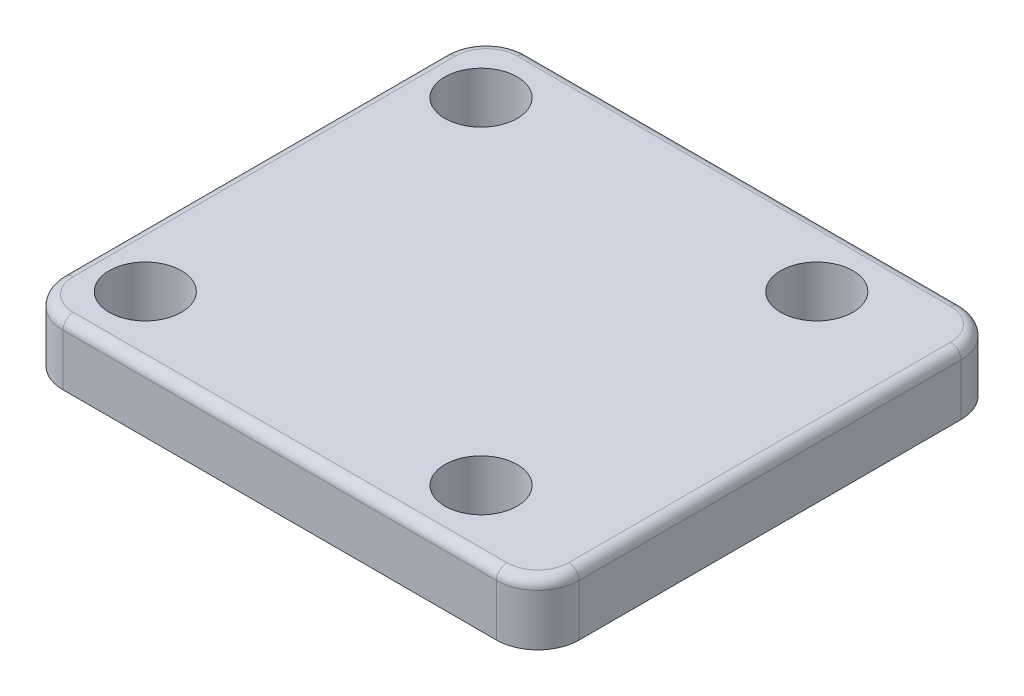
ISO-10303-21;
HEADER;
FILE_DESCRIPTION(('STEP AP214'),'2;1');
FILE_NAME('part.step','',(''),(''),'','','');
FILE_SCHEMA(('AUTOMOTIVE_DESIGN { 1 0 10303 214 1 1 1 1 }'));
ENDSEC;
DATA;
#1=APPLICATION_CONTEXT('core data for automotive mechanical design processes');
#2=APPLICATION_PROTOCOL_DEFINITION('international standard','automotive_design',2000,#1);
#3=PRODUCT_CONTEXT('',#1,'mechanical');
#4=PRODUCT('Part','Part','',(#3));
#5=PRODUCT_RELATED_PRODUCT_CATEGORY('part','',(#4));
#6=PRODUCT_DEFINITION_FORMATION('','',#4);
#7=PRODUCT_DEFINITION_CONTEXT('part definition',#1,'design');
#8=PRODUCT_DEFINITION('design','',#6,#7);
#9=PRODUCT_DEFINITION_SHAPE('','',#8);
#10=(LENGTH_UNIT() NAMED_UNIT(*) SI_UNIT(.MILLI.,.METRE.));
#11=(NAMED_UNIT(*) PLANE_ANGLE_UNIT() SI_UNIT($,.RADIAN.));
#12=(NAMED_UNIT(*) SI_UNIT($,.STERADIAN.) SOLID_ANGLE_UNIT());
#13=UNCERTAINTY_MEASURE_WITH_UNIT(LENGTH_MEASURE(1.E-05),#10,'distance_accuracy_value','');
#14=(GEOMETRIC_REPRESENTATION_CONTEXT(3) GLOBAL_UNCERTAINTY_ASSIGNED_CONTEXT((#13)) GLOBAL_UNIT_ASSIGNED_CONTEXT((#10,
#11,#12)) REPRESENTATION_CONTEXT('',''));
#15=CARTESIAN_POINT('',(0.,0.,0.));
#16=DIRECTION('',(0.,0.,1.));
#17=DIRECTION('',(1.,0.,0.));
#18=AXIS2_PLACEMENT_3D('',#15,#16,#17);
#19=CARTESIAN_POINT('',(-18.,6.,-18.5));
#20=DIRECTION('',(0.,-1.,0.));
#21=DIRECTION('',(0.,0.,-1.));
#22=AXIS2_PLACEMENT_3D('',#19,#20,#21);
#23=CYLINDRICAL_SURFACE('',#22,4.);
#24=DIRECTION('',(0.,-1.,0.));
#25=VECTOR('',#24,1.);
#26=CARTESIAN_POINT('',(-22.,6.,-18.5));
#27=LINE('',#26,#25);
#28=CARTESIAN_POINT('',(-22.,5.,-18.5));
#29=VERTEX_POINT('',#28);
#30=CARTESIAN_POINT('',(-22.,0.,-18.5));
#31=VERTEX_POINT('',#30);
#32=EDGE_CURVE('E139',#29,#31,#27,.T.);
#33=ORIENTED_EDGE('',*,*,#32,.F.);
#34=CARTESIAN_POINT('',(-18.,5.,-18.5));
#35=DIRECTION('',(0.,1.,0.));
#36=DIRECTION('',(0.,0.,1.));
#37=AXIS2_PLACEMENT_3D('',#34,#35,#36);
#38=CIRCLE('',#37,4.);
#39=CARTESIAN_POINT('',(-18.,5.,-22.5));
#40=VERTEX_POINT('',#39);
#41=EDGE_CURVE('E259',#29,#40,#38,.F.);
#42=ORIENTED_EDGE('',*,*,#41,.T.);
#43=DIRECTION('',(0.,-1.,0.));
#44=VECTOR('',#43,1.);
#45=CARTESIAN_POINT('',(-18.,6.,-22.5));
#46=LINE('',#45,#44);
#47=CARTESIAN_POINT('',(-18.,0.,-22.5));
#48=VERTEX_POINT('',#47);
#49=EDGE_CURVE('E162',#40,#48,#46,.T.);
#50=ORIENTED_EDGE('',*,*,#49,.T.);
#51=CARTESIAN_POINT('',(-18.,0.,-18.5));
#52=DIRECTION('',(0.,1.,0.));
#53=DIRECTION('',(0.,0.,1.));
#54=AXIS2_PLACEMENT_3D('',#51,#52,#53);
#55=CIRCLE('',#54,4.);
#56=EDGE_CURVE('E155',#48,#31,#55,.T.);
#57=ORIENTED_EDGE('',*,*,#56,.T.);
#58=EDGE_LOOP('',(#33,#42,#50,#57));
#59=FACE_BOUND('',#58,.T.);
#60=ADVANCED_FACE('F47',(#59),#23,.T.);
#61=CARTESIAN_POINT('',(-22.,6.,-18.5));
#62=DIRECTION('',(1.,0.,0.));
#63=DIRECTION('',(0.,0.,-1.));
#64=AXIS2_PLACEMENT_3D('',#61,#62,#63);
#65=PLANE('',#64);
#66=DIRECTION('',(0.,-1.,0.));
#67=VECTOR('',#66,1.);
#68=CARTESIAN_POINT('',(-22.,6.,18.5));
#69=LINE('',#68,#67);
#70=CARTESIAN_POINT('',(-22.,5.,18.5));
#71=VERTEX_POINT('',#70);
#72=CARTESIAN_POINT('',(-22.,0.,18.5));
#73=VERTEX_POINT('',#72);
#74=EDGE_CURVE('E149',#71,#73,#69,.T.);
#75=ORIENTED_EDGE('',*,*,#74,.F.);
#76=DIRECTION('',(0.,0.,1.));
#77=VECTOR('',#76,1.);
#78=CARTESIAN_POINT('',(-22.,5.,-18.5));
#79=LINE('',#78,#77);
#80=EDGE_CURVE('E66',#71,#29,#79,.F.);
#81=ORIENTED_EDGE('',*,*,#80,.T.);
#82=ORIENTED_EDGE('',*,*,#32,.T.);
#83=DIRECTION('',(0.,0.,1.));
#84=VECTOR('',#83,1.);
#85=CARTESIAN_POINT('',(-22.,0.,-18.5));
#86=LINE('',#85,#84);
#87=EDGE_CURVE('E142',#31,#73,#86,.T.);
#88=ORIENTED_EDGE('',*,*,#87,.T.);
#89=EDGE_LOOP('',(#75,#81,#82,#88));
#90=FACE_BOUND('',#89,.T.);
#91=ADVANCED_FACE('F141',(#90),#65,.F.);
#92=CARTESIAN_POINT('',(-18.,6.,18.5));
#93=DIRECTION('',(0.,-1.,0.));
#94=DIRECTION('',(0.,0.,-1.));
#95=AXIS2_PLACEMENT_3D('',#92,#93,#94);
#96=CYLINDRICAL_SURFACE('',#95,4.);
#97=DIRECTION('',(0.,-1.,0.));
#98=VECTOR('',#97,1.);
#99=CARTESIAN_POINT('',(-18.,6.,22.5));
#100=LINE('',#99,#98);
#101=CARTESIAN_POINT('',(-18.,5.,22.5));
#102=VERTEX_POINT('',#101);
#103=CARTESIAN_POINT('',(-18.,0.,22.5));
#104=VERTEX_POINT('',#103);
#105=EDGE_CURVE('E210',#102,#104,#100,.T.);
#106=ORIENTED_EDGE('',*,*,#105,.F.);
#107=CARTESIAN_POINT('',(-18.,5.,18.5));
#108=DIRECTION('',(0.,1.,0.));
#109=DIRECTION('',(0.,0.,1.));
#110=AXIS2_PLACEMENT_3D('',#107,#108,#109);
#111=CIRCLE('',#110,4.);
#112=EDGE_CURVE('E74',#102,#71,#111,.F.);
#113=ORIENTED_EDGE('',*,*,#112,.T.);
#114=ORIENTED_EDGE('',*,*,#74,.T.);
#115=CARTESIAN_POINT('',(-18.,0.,18.5));
#116=DIRECTION('',(0.,1.,0.));
#117=DIRECTION('',(0.,0.,-1.));
#118=AXIS2_PLACEMENT_3D('',#115,#116,#117);
#119=CIRCLE('',#118,4.);
#120=EDGE_CURVE('E158',#73,#104,#119,.T.);
#121=ORIENTED_EDGE('',*,*,#120,.T.);
#122=EDGE_LOOP('',(#106,#113,#114,#121));
#123=FACE_BOUND('',#122,.T.);
#124=ADVANCED_FACE('F326',(#123),#96,.T.);
#125=CARTESIAN_POINT('',(24.,6.,22.5));
#126=DIRECTION('',(0.,0.,-1.));
#127=DIRECTION('',(-1.,0.,0.));
#128=AXIS2_PLACEMENT_3D('',#125,#126,#127);
#129=PLANE('',#128);
#130=DIRECTION('',(0.,-1.,0.));
#131=VECTOR('',#130,1.);
#132=CARTESIAN_POINT('',(24.,6.,22.5));
#133=LINE('',#132,#131);
#134=CARTESIAN_POINT('',(24.,5.,22.5));
#135=VERTEX_POINT('',#134);
#136=CARTESIAN_POINT('',(24.,0.,22.5));
#137=VERTEX_POINT('',#136);
#138=EDGE_CURVE('E207',#135,#137,#133,.T.);
#139=ORIENTED_EDGE('',*,*,#138,.F.);
#140=DIRECTION('',(1.,0.,0.));
#141=VECTOR('',#140,1.);
#142=CARTESIAN_POINT('',(-18.,5.,22.5));
#143=LINE('',#142,#141);
#144=EDGE_CURVE('E252',#135,#102,#143,.F.);
#145=ORIENTED_EDGE('',*,*,#144,.T.);
#146=ORIENTED_EDGE('',*,*,#105,.T.);
#147=DIRECTION('',(1.,0.,0.));
#148=VECTOR('',#147,1.);
#149=CARTESIAN_POINT('',(24.,0.,22.5));
#150=LINE('',#149,#148);
#151=EDGE_CURVE('E177',#104,#137,#150,.T.);
#152=ORIENTED_EDGE('',*,*,#151,.T.);
#153=EDGE_LOOP('',(#139,#145,#146,#152));
#154=FACE_BOUND('',#153,.T.);
#155=ADVANCED_FACE('F402',(#154),#129,.F.);
#156=CARTESIAN_POINT('',(24.,6.,18.5));
#157=DIRECTION('',(0.,-1.,0.));
#158=DIRECTION('',(0.,0.,-1.));
#159=AXIS2_PLACEMENT_3D('',#156,#157,#158);
#160=CYLINDRICAL_SURFACE('',#159,4.);
#161=DIRECTION('',(0.,-1.,0.));
#162=VECTOR('',#161,1.);
#163=CARTESIAN_POINT('',(28.,6.,18.5));
#164=LINE('',#163,#162);
#165=CARTESIAN_POINT('',(28.,5.,18.5));
#166=VERTEX_POINT('',#165);
#167=CARTESIAN_POINT('',(28.,0.,18.5));
#168=VERTEX_POINT('',#167);
#169=EDGE_CURVE('E204',#166,#168,#164,.T.);
#170=ORIENTED_EDGE('',*,*,#169,.F.);
#171=CARTESIAN_POINT('',(24.,5.,18.5));
#172=DIRECTION('',(0.,1.,0.));
#173=DIRECTION('',(0.,0.,1.));
#174=AXIS2_PLACEMENT_3D('',#171,#172,#173);
#175=CIRCLE('',#174,4.);
#176=EDGE_CURVE('E249',#166,#135,#175,.F.);
#177=ORIENTED_EDGE('',*,*,#176,.T.);
#178=ORIENTED_EDGE('',*,*,#138,.T.);
#179=CARTESIAN_POINT('',(24.,0.,18.5));
#180=DIRECTION('',(0.,1.,0.));
#181=DIRECTION('',(0.,0.,-1.));
#182=AXIS2_PLACEMENT_3D('',#179,#180,#181);
#183=CIRCLE('',#182,4.);
#184=EDGE_CURVE('E181',#137,#168,#183,.T.);
#185=ORIENTED_EDGE('',*,*,#184,.T.);
#186=EDGE_LOOP('',(#170,#177,#178,#185));
#187=FACE_BOUND('',#186,.T.);
#188=ADVANCED_FACE('F400',(#187),#160,.T.);
#189=CARTESIAN_POINT('',(28.,6.,-18.5));
#190=DIRECTION('',(-1.,0.,0.));
#191=DIRECTION('',(0.,0.,1.));
#192=AXIS2_PLACEMENT_3D('',#189,#190,#191);
#193=PLANE('',#192);
#194=DIRECTION('',(0.,-1.,0.));
#195=VECTOR('',#194,1.);
#196=CARTESIAN_POINT('',(28.,6.,-18.5));
#197=LINE('',#196,#195);
#198=CARTESIAN_POINT('',(28.,5.,-18.5));
#199=VERTEX_POINT('',#198);
#200=CARTESIAN_POINT('',(28.,0.,-18.5));
#201=VERTEX_POINT('',#200);
#202=EDGE_CURVE('E201',#199,#201,#197,.T.);
#203=ORIENTED_EDGE('',*,*,#202,.F.);
#204=DIRECTION('',(0.,0.,-1.));
#205=VECTOR('',#204,1.);
#206=CARTESIAN_POINT('',(28.,5.,18.5));
#207=LINE('',#206,#205);
#208=EDGE_CURVE('E246',#199,#166,#207,.F.);
#209=ORIENTED_EDGE('',*,*,#208,.T.);
#210=ORIENTED_EDGE('',*,*,#169,.T.);
#211=DIRECTION('',(0.,0.,-1.));
#212=VECTOR('',#211,1.);
#213=CARTESIAN_POINT('',(28.,0.,-18.5));
#214=LINE('',#213,#212);
#215=EDGE_CURVE('E185',#168,#201,#214,.T.);
#216=ORIENTED_EDGE('',*,*,#215,.T.);
#217=EDGE_LOOP('',(#203,#209,#210,#216));
#218=FACE_BOUND('',#217,.T.);
#219=ADVANCED_FACE('F390',(#218),#193,.F.);
#220=CARTESIAN_POINT('',(24.,6.,-18.5));
#221=DIRECTION('',(0.,-1.,0.));
#222=DIRECTION('',(0.,0.,-1.));
#223=AXIS2_PLACEMENT_3D('',#220,#221,#222);
#224=CYLINDRICAL_SURFACE('',#223,4.);
#225=DIRECTION('',(0.,-1.,0.));
#226=VECTOR('',#225,1.);
#227=CARTESIAN_POINT('',(24.,6.,-22.5));
#228=LINE('',#227,#226);
#229=CARTESIAN_POINT('',(24.,5.,-22.5));
#230=VERTEX_POINT('',#229);
#231=CARTESIAN_POINT('',(24.,0.,-22.5));
#232=VERTEX_POINT('',#231);
#233=EDGE_CURVE('E198',#230,#232,#228,.T.);
#234=ORIENTED_EDGE('',*,*,#233,.F.);
#235=CARTESIAN_POINT('',(24.,5.,-18.5));
#236=DIRECTION('',(0.,1.,0.));
#237=DIRECTION('',(0.,0.,1.));
#238=AXIS2_PLACEMENT_3D('',#235,#236,#237);
#239=CIRCLE('',#238,4.);
#240=EDGE_CURVE('E243',#230,#199,#239,.F.);
#241=ORIENTED_EDGE('',*,*,#240,.T.);
#242=ORIENTED_EDGE('',*,*,#202,.T.);
#243=CARTESIAN_POINT('',(24.,0.,-18.5));
#244=DIRECTION('',(0.,1.,0.));
#245=DIRECTION('',(0.,0.,-1.));
#246=AXIS2_PLACEMENT_3D('',#243,#244,#245);
#247=CIRCLE('',#246,4.);
#248=EDGE_CURVE('E189',#201,#232,#247,.T.);
#249=ORIENTED_EDGE('',*,*,#248,.T.);
#250=EDGE_LOOP('',(#234,#241,#242,#249));
#251=FACE_BOUND('',#250,.T.);
#252=ADVANCED_FACE('F387',(#251),#224,.T.);
#253=CARTESIAN_POINT('',(24.,6.,-22.5));
#254=DIRECTION('',(0.,0.,1.));
#255=DIRECTION('',(1.,0.,0.));
#256=AXIS2_PLACEMENT_3D('',#253,#254,#255);
#257=PLANE('',#256);
#258=ORIENTED_EDGE('',*,*,#49,.F.);
#259=DIRECTION('',(-1.,0.,0.));
#260=VECTOR('',#259,1.);
#261=CARTESIAN_POINT('',(24.,5.,-22.5));
#262=LINE('',#261,#260);
#263=EDGE_CURVE('E239',#40,#230,#262,.F.);
#264=ORIENTED_EDGE('',*,*,#263,.T.);
#265=ORIENTED_EDGE('',*,*,#233,.T.);
#266=DIRECTION('',(-1.,0.,0.));
#267=VECTOR('',#266,1.);
#268=CARTESIAN_POINT('',(24.,0.,-22.5));
#269=LINE('',#268,#267);
#270=EDGE_CURVE('E193',#232,#48,#269,.T.);
#271=ORIENTED_EDGE('',*,*,#270,.T.);
#272=EDGE_LOOP('',(#258,#264,#265,#271));
#273=FACE_BOUND('',#272,.T.);
#274=ADVANCED_FACE('F378',(#273),#257,.F.);
#275=CARTESIAN_POINT('',(-18.,6.,-18.5));
#276=DIRECTION('',(0.,1.,0.));
#277=DIRECTION('',(0.,0.,1.));
#278=AXIS2_PLACEMENT_3D('',#275,#276,#277);
#279=PLANE('',#278);
#280=CARTESIAN_POINT('',(-16.2634559672897,6.,16.2634559672906));
#281=DIRECTION('',(0.,1.,0.));
#282=DIRECTION('',(0.,0.,1.));
#283=AXIS2_PLACEMENT_3D('',#280,#281,#282);
#284=CIRCLE('',#283,3.50000000000048);
#285=CARTESIAN_POINT('',(-16.2634559672897,6.,19.7634559672911));
#286=VERTEX_POINT('',#285);
#287=EDGE_CURVE('E455',#286,#286,#284,.T.);
#288=ORIENTED_EDGE('',*,*,#287,.F.);
#289=EDGE_LOOP('',(#288));
#290=FACE_BOUND('',#289,.T.);
#291=CARTESIAN_POINT('',(16.2634559672915,6.,16.2634559672897));
#292=DIRECTION('',(0.,1.,0.));
#293=DIRECTION('',(0.,0.,1.));
#294=AXIS2_PLACEMENT_3D('',#291,#292,#293);
#295=CIRCLE('',#294,3.50000000000127);
#296=CARTESIAN_POINT('',(16.2634559672915,6.,19.763455967291));
#297=VERTEX_POINT('',#296);
#298=EDGE_CURVE('E452',#297,#297,#295,.T.);
#299=ORIENTED_EDGE('',*,*,#298,.F.);
#300=EDGE_LOOP('',(#299));
#301=FACE_BOUND('',#300,.T.);
#302=CARTESIAN_POINT('',(16.2634559672906,6.,-16.2634559672915));
#303=DIRECTION('',(0.,1.,0.));
#304=DIRECTION('',(0.,0.,1.));
#305=AXIS2_PLACEMENT_3D('',#302,#303,#304);
#306=CIRCLE('',#305,3.50000000000094);
#307=CARTESIAN_POINT('',(16.2634559672906,6.,-12.7634559672905));
#308=VERTEX_POINT('',#307);
#309=EDGE_CURVE('E449',#308,#308,#306,.T.);
#310=ORIENTED_EDGE('',*,*,#309,.F.);
#311=EDGE_LOOP('',(#310));
#312=FACE_BOUND('',#311,.T.);
#313=CARTESIAN_POINT('',(-16.2634559672906,6.,-16.2634559672906));
#314=DIRECTION('',(0.,1.,0.));
#315=DIRECTION('',(0.,0.,1.));
#316=AXIS2_PLACEMENT_3D('',#313,#314,#315);
#317=CIRCLE('',#316,3.5);
#318=CARTESIAN_POINT('',(-16.2634559672906,6.,-12.7634559672906));
#319=VERTEX_POINT('',#318);
#320=EDGE_CURVE('E295',#319,#319,#317,.T.);
#321=ORIENTED_EDGE('',*,*,#320,.F.);
#322=EDGE_LOOP('',(#321));
#323=FACE_BOUND('',#322,.T.);
#324=CARTESIAN_POINT('',(24.,6.,-18.5));
#325=DIRECTION('',(0.,1.,0.));
#326=DIRECTION('',(0.,0.,1.));
#327=AXIS2_PLACEMENT_3D('',#324,#325,#326);
#328=CIRCLE('',#327,3.);
#329=CARTESIAN_POINT('',(27.,6.,-18.5));
#330=VERTEX_POINT('',#329);
#331=CARTESIAN_POINT('',(24.,6.,-21.5));
#332=VERTEX_POINT('',#331);
#333=EDGE_CURVE('E232',#330,#332,#328,.T.);
#334=ORIENTED_EDGE('',*,*,#333,.T.);
#335=DIRECTION('',(-1.,0.,0.));
#336=VECTOR('',#335,1.);
#337=CARTESIAN_POINT('',(-18.,6.,-21.5));
#338=LINE('',#337,#336);
#339=CARTESIAN_POINT('',(-18.,6.,-21.5));
#340=VERTEX_POINT('',#339);
#341=EDGE_CURVE('E235',#332,#340,#338,.T.);
#342=ORIENTED_EDGE('',*,*,#341,.T.);
#343=CARTESIAN_POINT('',(-18.,6.,-18.5));
#344=DIRECTION('',(0.,1.,0.));
#345=DIRECTION('',(0.,0.,1.));
#346=AXIS2_PLACEMENT_3D('',#343,#344,#345);
#347=CIRCLE('',#346,3.);
#348=CARTESIAN_POINT('',(-21.,6.,-18.5));
#349=VERTEX_POINT('',#348);
#350=EDGE_CURVE('E148',#340,#349,#347,.T.);
#351=ORIENTED_EDGE('',*,*,#350,.T.);
#352=DIRECTION('',(0.,0.,1.));
#353=VECTOR('',#352,1.);
#354=CARTESIAN_POINT('',(-21.,6.,18.5));
#355=LINE('',#354,#353);
#356=CARTESIAN_POINT('',(-21.,6.,18.5));
#357=VERTEX_POINT('',#356);
#358=EDGE_CURVE('E217',#349,#357,#355,.T.);
#359=ORIENTED_EDGE('',*,*,#358,.T.);
#360=CARTESIAN_POINT('',(-18.,6.,18.5));
#361=DIRECTION('',(0.,1.,0.));
#362=DIRECTION('',(0.,0.,1.));
#363=AXIS2_PLACEMENT_3D('',#360,#361,#362);
#364=CIRCLE('',#363,3.);
#365=CARTESIAN_POINT('',(-18.,6.,21.5));
#366=VERTEX_POINT('',#365);
#367=EDGE_CURVE('E220',#357,#366,#364,.T.);
#368=ORIENTED_EDGE('',*,*,#367,.T.);
#369=DIRECTION('',(1.,0.,0.));
#370=VECTOR('',#369,1.);
#371=CARTESIAN_POINT('',(24.,6.,21.5));
#372=LINE('',#371,#370);
#373=CARTESIAN_POINT('',(24.,6.,21.5));
#374=VERTEX_POINT('',#373);
#375=EDGE_CURVE('E223',#366,#374,#372,.T.);
#376=ORIENTED_EDGE('',*,*,#375,.T.);
#377=CARTESIAN_POINT('',(24.,6.,18.5));
#378=DIRECTION('',(0.,1.,0.));
#379=DIRECTION('',(0.,0.,1.));
#380=AXIS2_PLACEMENT_3D('',#377,#378,#379);
#381=CIRCLE('',#380,3.);
#382=CARTESIAN_POINT('',(27.,6.,18.5));
#383=VERTEX_POINT('',#382);
#384=EDGE_CURVE('E226',#374,#383,#381,.T.);
#385=ORIENTED_EDGE('',*,*,#384,.T.);
#386=DIRECTION('',(0.,0.,-1.));
#387=VECTOR('',#386,1.);
#388=CARTESIAN_POINT('',(27.,6.,-18.5));
#389=LINE('',#388,#387);
#390=EDGE_CURVE('E229',#383,#330,#389,.T.);
#391=ORIENTED_EDGE('',*,*,#390,.T.);
#392=EDGE_LOOP('',(#334,#342,#351,#359,#368,#376,#385,#391));
#393=FACE_BOUND('',#392,.T.);
#394=ADVANCED_FACE('F364',(#290,#301,#312,#323,#393),#279,.T.);
#395=CARTESIAN_POINT('',(-18.,0.,-18.5));
#396=DIRECTION('',(0.,1.,0.));
#397=DIRECTION('',(0.,0.,1.));
#398=AXIS2_PLACEMENT_3D('',#395,#396,#397);
#399=PLANE('',#398);
#400=CARTESIAN_POINT('',(-16.2634559672897,0.,16.2634559672906));
#401=DIRECTION('',(0.,1.,0.));
#402=DIRECTION('',(0.,0.,1.));
#403=AXIS2_PLACEMENT_3D('',#400,#401,#402);
#404=CIRCLE('',#403,3.50000000000048);
#405=CARTESIAN_POINT('',(-16.2634559672897,0.,19.7634559672911));
#406=VERTEX_POINT('',#405);
#407=EDGE_CURVE('E52',#406,#406,#404,.T.);
#408=ORIENTED_EDGE('',*,*,#407,.T.);
#409=EDGE_LOOP('',(#408));
#410=FACE_BOUND('',#409,.T.);
#411=CARTESIAN_POINT('',(16.2634559672915,0.,16.2634559672897));
#412=DIRECTION('',(0.,1.,0.));
#413=DIRECTION('',(0.,0.,1.));
#414=AXIS2_PLACEMENT_3D('',#411,#412,#413);
#415=CIRCLE('',#414,3.50000000000127);
#416=CARTESIAN_POINT('',(16.2634559672915,0.,19.763455967291));
#417=VERTEX_POINT('',#416);
#418=EDGE_CURVE('E298',#417,#417,#415,.T.);
#419=ORIENTED_EDGE('',*,*,#418,.T.);
#420=EDGE_LOOP('',(#419));
#421=FACE_BOUND('',#420,.T.);
#422=CARTESIAN_POINT('',(16.2634559672906,0.,-16.2634559672915));
#423=DIRECTION('',(0.,1.,0.));
#424=DIRECTION('',(0.,0.,1.));
#425=AXIS2_PLACEMENT_3D('',#422,#423,#424);
#426=CIRCLE('',#425,3.50000000000094);
#427=CARTESIAN_POINT('',(16.2634559672906,0.,-12.7634559672905));
#428=VERTEX_POINT('',#427);
#429=EDGE_CURVE('E294',#428,#428,#426,.T.);
#430=ORIENTED_EDGE('',*,*,#429,.T.);
#431=EDGE_LOOP('',(#430));
#432=FACE_BOUND('',#431,.T.);
#433=CARTESIAN_POINT('',(-16.2634559672906,0.,-16.2634559672906));
#434=DIRECTION('',(0.,1.,0.));
#435=DIRECTION('',(0.,0.,1.));
#436=AXIS2_PLACEMENT_3D('',#433,#434,#435);
#437=CIRCLE('',#436,3.5);
#438=CARTESIAN_POINT('',(-16.2634559672906,0.,-12.7634559672906));
#439=VERTEX_POINT('',#438);
#440=EDGE_CURVE('E290',#439,#439,#437,.T.);
#441=ORIENTED_EDGE('',*,*,#440,.T.);
#442=EDGE_LOOP('',(#441));
#443=FACE_BOUND('',#442,.T.);
#444=CARTESIAN_POINT('',(0.,0.,0.));
#445=DIRECTION('',(0.,-1.,0.));
#446=DIRECTION('',(0.,0.,-1.));
#447=AXIS2_PLACEMENT_3D('',#444,#445,#446);
#448=CIRCLE('',#447,16.);
#449=CARTESIAN_POINT('',(0.,0.,-16.));
#450=VERTEX_POINT('',#449);
#451=EDGE_CURVE('E172',#450,#450,#448,.T.);
#452=ORIENTED_EDGE('',*,*,#451,.F.);
#453=EDGE_LOOP('',(#452));
#454=FACE_BOUND('',#453,.T.);
#455=ORIENTED_EDGE('',*,*,#56,.F.);
#456=ORIENTED_EDGE('',*,*,#270,.F.);
#457=ORIENTED_EDGE('',*,*,#248,.F.);
#458=ORIENTED_EDGE('',*,*,#215,.F.);
#459=ORIENTED_EDGE('',*,*,#184,.F.);
#460=ORIENTED_EDGE('',*,*,#151,.F.);
#461=ORIENTED_EDGE('',*,*,#120,.F.);
#462=ORIENTED_EDGE('',*,*,#87,.F.);
#463=EDGE_LOOP('',(#455,#456,#457,#458,#459,#460,#461,#462));
#464=FACE_BOUND('',#463,.T.);
#465=ADVANCED_FACE('F153',(#410,#421,#432,#443,#454,#464),#399,.F.);
#466=CARTESIAN_POINT('',(-18.,5.,21.5));
#467=DIRECTION('',(-1.,0.,0.));
#468=DIRECTION('',(0.,0.,1.));
#469=AXIS2_PLACEMENT_3D('',#466,#467,#468);
#470=CYLINDRICAL_SURFACE('',#469,1.);
#471=CARTESIAN_POINT('',(-18.,5.,21.5));
#472=DIRECTION('',(-1.,0.,0.));
#473=DIRECTION('',(0.,0.,1.));
#474=AXIS2_PLACEMENT_3D('',#471,#472,#473);
#475=CIRCLE('',#474,1.);
#476=EDGE_CURVE('E169',#102,#366,#475,.T.);
#477=ORIENTED_EDGE('',*,*,#476,.F.);
#478=ORIENTED_EDGE('',*,*,#144,.F.);
#479=CARTESIAN_POINT('',(24.,5.,21.5));
#480=DIRECTION('',(1.,0.,0.));
#481=DIRECTION('',(0.,0.,-1.));
#482=AXIS2_PLACEMENT_3D('',#479,#480,#481);
#483=CIRCLE('',#482,1.);
#484=EDGE_CURVE('E165',#374,#135,#483,.T.);
#485=ORIENTED_EDGE('',*,*,#484,.F.);
#486=ORIENTED_EDGE('',*,*,#375,.F.);
#487=EDGE_LOOP('',(#477,#478,#485,#486));
#488=FACE_BOUND('',#487,.T.);
#489=ADVANCED_FACE('F357',(#488),#470,.T.);
#490=CARTESIAN_POINT('',(24.,5.,18.5));
#491=DIRECTION('',(0.,1.,0.));
#492=DIRECTION('',(0.,0.,1.));
#493=AXIS2_PLACEMENT_3D('',#490,#491,#492);
#494=TOROIDAL_SURFACE('',#493,3.,1.);
#495=ORIENTED_EDGE('',*,*,#484,.T.);
#496=ORIENTED_EDGE('',*,*,#176,.F.);
#497=CARTESIAN_POINT('',(27.,5.,18.5));
#498=DIRECTION('',(0.,0.,-1.));
#499=DIRECTION('',(-1.,0.,0.));
#500=AXIS2_PLACEMENT_3D('',#497,#498,#499);
#501=CIRCLE('',#500,1.);
#502=EDGE_CURVE('E280',#383,#166,#501,.T.);
#503=ORIENTED_EDGE('',*,*,#502,.F.);
#504=ORIENTED_EDGE('',*,*,#384,.F.);
#505=EDGE_LOOP('',(#495,#496,#503,#504));
#506=FACE_BOUND('',#505,.T.);
#507=ADVANCED_FACE('F354',(#506),#494,.T.);
#508=CARTESIAN_POINT('',(-18.,5.,18.5));
#509=DIRECTION('',(0.,1.,0.));
#510=DIRECTION('',(0.,0.,1.));
#511=AXIS2_PLACEMENT_3D('',#508,#509,#510);
#512=TOROIDAL_SURFACE('',#511,3.,1.);
#513=ORIENTED_EDGE('',*,*,#476,.T.);
#514=ORIENTED_EDGE('',*,*,#367,.F.);
#515=CARTESIAN_POINT('',(-21.,5.,18.5));
#516=DIRECTION('',(0.,0.,-1.));
#517=DIRECTION('',(-1.,0.,0.));
#518=AXIS2_PLACEMENT_3D('',#515,#516,#517);
#519=CIRCLE('',#518,1.);
#520=EDGE_CURVE('E276',#71,#357,#519,.T.);
#521=ORIENTED_EDGE('',*,*,#520,.F.);
#522=ORIENTED_EDGE('',*,*,#112,.F.);
#523=EDGE_LOOP('',(#513,#514,#521,#522));
#524=FACE_BOUND('',#523,.T.);
#525=ADVANCED_FACE('F350',(#524),#512,.T.);
#526=CARTESIAN_POINT('',(27.,5.,-18.5));
#527=DIRECTION('',(0.,0.,1.));
#528=DIRECTION('',(1.,0.,0.));
#529=AXIS2_PLACEMENT_3D('',#526,#527,#528);
#530=CYLINDRICAL_SURFACE('',#529,1.);
#531=ORIENTED_EDGE('',*,*,#502,.T.);
#532=ORIENTED_EDGE('',*,*,#208,.F.);
#533=CARTESIAN_POINT('',(27.,5.,-18.5));
#534=DIRECTION('',(0.,0.,-1.));
#535=DIRECTION('',(-1.,0.,0.));
#536=AXIS2_PLACEMENT_3D('',#533,#534,#535);
#537=CIRCLE('',#536,1.);
#538=EDGE_CURVE('E272',#330,#199,#537,.T.);
#539=ORIENTED_EDGE('',*,*,#538,.F.);
#540=ORIENTED_EDGE('',*,*,#390,.F.);
#541=EDGE_LOOP('',(#531,#532,#539,#540));
#542=FACE_BOUND('',#541,.T.);
#543=ADVANCED_FACE('F346',(#542),#530,.T.);
#544=CARTESIAN_POINT('',(-21.,5.,-18.5));
#545=DIRECTION('',(0.,0.,-1.));
#546=DIRECTION('',(-1.,0.,0.));
#547=AXIS2_PLACEMENT_3D('',#544,#545,#546);
#548=CYLINDRICAL_SURFACE('',#547,1.);
#549=ORIENTED_EDGE('',*,*,#520,.T.);
#550=ORIENTED_EDGE('',*,*,#358,.F.);
#551=CARTESIAN_POINT('',(-21.,5.,-18.5));
#552=DIRECTION('',(0.,0.,-1.));
#553=DIRECTION('',(-1.,0.,0.));
#554=AXIS2_PLACEMENT_3D('',#551,#552,#553);
#555=CIRCLE('',#554,1.);
#556=EDGE_CURVE('E268',#29,#349,#555,.T.);
#557=ORIENTED_EDGE('',*,*,#556,.F.);
#558=ORIENTED_EDGE('',*,*,#80,.F.);
#559=EDGE_LOOP('',(#549,#550,#557,#558));
#560=FACE_BOUND('',#559,.T.);
#561=ADVANCED_FACE('F342',(#560),#548,.T.);
#562=CARTESIAN_POINT('',(24.,5.,-18.5));
#563=DIRECTION('',(0.,1.,0.));
#564=DIRECTION('',(0.,0.,1.));
#565=AXIS2_PLACEMENT_3D('',#562,#563,#564);
#566=TOROIDAL_SURFACE('',#565,3.,1.);
#567=ORIENTED_EDGE('',*,*,#538,.T.);
#568=ORIENTED_EDGE('',*,*,#240,.F.);
#569=CARTESIAN_POINT('',(24.,5.,-21.5));
#570=DIRECTION('',(-1.,0.,0.));
#571=DIRECTION('',(0.,0.,1.));
#572=AXIS2_PLACEMENT_3D('',#569,#570,#571);
#573=CIRCLE('',#572,1.);
#574=EDGE_CURVE('E265',#332,#230,#573,.T.);
#575=ORIENTED_EDGE('',*,*,#574,.F.);
#576=ORIENTED_EDGE('',*,*,#333,.F.);
#577=EDGE_LOOP('',(#567,#568,#575,#576));
#578=FACE_BOUND('',#577,.T.);
#579=ADVANCED_FACE('F338',(#578),#566,.T.);
#580=CARTESIAN_POINT('',(-18.,5.,-18.5));
#581=DIRECTION('',(0.,1.,0.));
#582=DIRECTION('',(0.,0.,1.));
#583=AXIS2_PLACEMENT_3D('',#580,#581,#582);
#584=TOROIDAL_SURFACE('',#583,3.,1.);
#585=ORIENTED_EDGE('',*,*,#556,.T.);
#586=ORIENTED_EDGE('',*,*,#350,.F.);
#587=CARTESIAN_POINT('',(-18.,5.,-21.5));
#588=DIRECTION('',(1.,0.,0.));
#589=DIRECTION('',(0.,1.,0.));
#590=AXIS2_PLACEMENT_3D('',#587,#588,#589);
#591=CIRCLE('',#590,1.);
#592=EDGE_CURVE('E262',#40,#340,#591,.T.);
#593=ORIENTED_EDGE('',*,*,#592,.F.);
#594=ORIENTED_EDGE('',*,*,#41,.F.);
#595=EDGE_LOOP('',(#585,#586,#593,#594));
#596=FACE_BOUND('',#595,.T.);
#597=ADVANCED_FACE('F334',(#596),#584,.T.);
#598=CARTESIAN_POINT('',(-18.,5.,-21.5));
#599=DIRECTION('',(1.,0.,0.));
#600=DIRECTION('',(0.,0.,-1.));
#601=AXIS2_PLACEMENT_3D('',#598,#599,#600);
#602=CYLINDRICAL_SURFACE('',#601,1.);
#603=ORIENTED_EDGE('',*,*,#574,.T.);
#604=ORIENTED_EDGE('',*,*,#263,.F.);
#605=ORIENTED_EDGE('',*,*,#592,.T.);
#606=ORIENTED_EDGE('',*,*,#341,.F.);
#607=EDGE_LOOP('',(#603,#604,#605,#606));
#608=FACE_BOUND('',#607,.T.);
#609=ADVANCED_FACE('F330',(#608),#602,.T.);
#610=CARTESIAN_POINT('',(0.,-2.,0.));
#611=DIRECTION('',(0.,1.,0.));
#612=DIRECTION('',(0.,0.,1.));
#613=AXIS2_PLACEMENT_3D('',#610,#611,#612);
#614=CYLINDRICAL_SURFACE('',#613,16.);
#615=CARTESIAN_POINT('',(0.,-0.999999999999987,0.));
#616=DIRECTION('',(0.,-1.,0.));
#617=DIRECTION('',(0.,0.,-1.));
#618=AXIS2_PLACEMENT_3D('',#615,#616,#617);
#619=CIRCLE('',#618,16.);
#620=CARTESIAN_POINT('',(0.,-0.999999999999987,-16.));
#621=VERTEX_POINT('',#620);
#622=EDGE_CURVE('E11',#621,#621,#619,.F.);
#623=ORIENTED_EDGE('',*,*,#622,.T.);
#624=EDGE_LOOP('',(#623));
#625=FACE_BOUND('',#624,.T.);
#626=ORIENTED_EDGE('',*,*,#451,.T.);
#627=EDGE_LOOP('',(#626));
#628=FACE_BOUND('',#627,.T.);
#629=ADVANCED_FACE('F333',(#625,#628),#614,.T.);
#630=CARTESIAN_POINT('',(0.,-2.,0.));
#631=DIRECTION('',(0.,-1.,0.));
#632=DIRECTION('',(0.,0.,-1.));
#633=AXIS2_PLACEMENT_3D('',#630,#631,#632);
#634=PLANE('',#633);
#635=CARTESIAN_POINT('',(0.,-2.,0.));
#636=DIRECTION('',(0.,-1.,0.));
#637=DIRECTION('',(0.,0.,-1.));
#638=AXIS2_PLACEMENT_3D('',#635,#636,#637);
#639=CIRCLE('',#638,14.2679491924311);
#640=CARTESIAN_POINT('',(0.,-2.,-14.2679491924311));
#641=VERTEX_POINT('',#640);
#642=EDGE_CURVE('E58',#641,#641,#639,.T.);
#643=ORIENTED_EDGE('',*,*,#642,.T.);
#644=EDGE_LOOP('',(#643));
#645=FACE_BOUND('',#644,.T.);
#646=ADVANCED_FACE('F423',(#645),#634,.T.);
#647=CARTESIAN_POINT('',(0.,-2.,0.));
#648=DIRECTION('',(0.,1.,0.));
#649=DIRECTION('',(0.,0.,1.));
#650=AXIS2_PLACEMENT_3D('',#647,#648,#649);
#651=CONICAL_SURFACE('',#650,14.2679491924311,1.0471975511966);
#652=ORIENTED_EDGE('',*,*,#622,.F.);
#653=EDGE_LOOP('',(#652));
#654=FACE_BOUND('',#653,.T.);
#655=ORIENTED_EDGE('',*,*,#642,.F.);
#656=EDGE_LOOP('',(#655));
#657=FACE_BOUND('',#656,.T.);
#658=ADVANCED_FACE('F50',(#654,#657),#651,.T.);
#659=CARTESIAN_POINT('',(-16.2634559672906,-2.,-16.2634559672906));
#660=DIRECTION('',(0.,1.,0.));
#661=DIRECTION('',(0.,0.,1.));
#662=AXIS2_PLACEMENT_3D('',#659,#660,#661);
#663=CYLINDRICAL_SURFACE('',#662,3.5);
#664=ORIENTED_EDGE('',*,*,#320,.T.);
#665=EDGE_LOOP('',(#664));
#666=FACE_BOUND('',#665,.T.);
#667=ORIENTED_EDGE('',*,*,#440,.F.);
#668=EDGE_LOOP('',(#667));
#669=FACE_BOUND('',#668,.T.);
#670=ADVANCED_FACE('F427',(#666,#669),#663,.F.);
#671=CARTESIAN_POINT('',(16.2634559672906,-2.,-16.2634559672915));
#672=DIRECTION('',(0.,1.,0.));
#673=DIRECTION('',(0.,0.,1.));
#674=AXIS2_PLACEMENT_3D('',#671,#672,#673);
#675=CYLINDRICAL_SURFACE('',#674,3.50000000000094);
#676=ORIENTED_EDGE('',*,*,#309,.T.);
#677=EDGE_LOOP('',(#676));
#678=FACE_BOUND('',#677,.T.);
#679=ORIENTED_EDGE('',*,*,#429,.F.);
#680=EDGE_LOOP('',(#679));
#681=FACE_BOUND('',#680,.T.);
#682=ADVANCED_FACE('F316',(#678,#681),#675,.F.);
#683=CARTESIAN_POINT('',(16.2634559672915,-2.,16.2634559672897));
#684=DIRECTION('',(0.,1.,0.));
#685=DIRECTION('',(0.,0.,1.));
#686=AXIS2_PLACEMENT_3D('',#683,#684,#685);
#687=CYLINDRICAL_SURFACE('',#686,3.50000000000127);
#688=ORIENTED_EDGE('',*,*,#298,.T.);
#689=EDGE_LOOP('',(#688));
#690=FACE_BOUND('',#689,.T.);
#691=ORIENTED_EDGE('',*,*,#418,.F.);
#692=EDGE_LOOP('',(#691));
#693=FACE_BOUND('',#692,.T.);
#694=ADVANCED_FACE('F310',(#690,#693),#687,.F.);
#695=CARTESIAN_POINT('',(-16.2634559672897,-2.,16.2634559672906));
#696=DIRECTION('',(0.,1.,0.));
#697=DIRECTION('',(0.,0.,1.));
#698=AXIS2_PLACEMENT_3D('',#695,#696,#697);
#699=CYLINDRICAL_SURFACE('',#698,3.50000000000048);
#700=ORIENTED_EDGE('',*,*,#287,.T.);
#701=EDGE_LOOP('',(#700));
#702=FACE_BOUND('',#701,.T.);
#703=ORIENTED_EDGE('',*,*,#407,.F.);
#704=EDGE_LOOP('',(#703));
#705=FACE_BOUND('',#704,.T.);
#706=ADVANCED_FACE('F308',(#702,#705),#699,.F.);
#707=CLOSED_SHELL('',(#60,#91,#124,#155,#188,#219,#252,#274,#394,#465,#489,#507,#525,#543,#561,
#579,#597,#609,#629,#646,#658,#670,#682,#694,#706));
#708=MANIFOLD_SOLID_BREP('B2',#707);
#709=ADVANCED_BREP_SHAPE_REPRESENTATION('',(#18,#708),#14);
#710=SHAPE_DEFINITION_REPRESENTATION(#9,#709);
ENDSEC;
END-ISO-10303-21;
